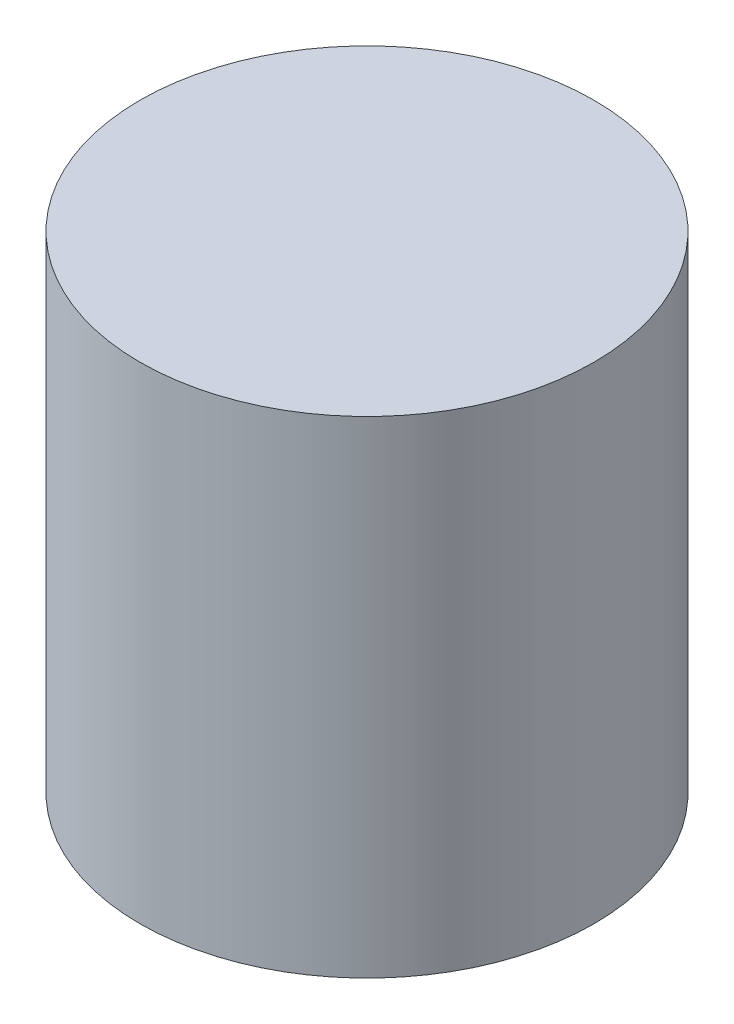
ISO-10303-21;
HEADER;
FILE_DESCRIPTION(('STEP AP214'),'2;1');
FILE_NAME('part.step','',(''),(''),'','','');
FILE_SCHEMA(('AUTOMOTIVE_DESIGN { 1 0 10303 214 1 1 1 1 }'));
ENDSEC;
DATA;
#1=APPLICATION_CONTEXT('core data for automotive mechanical design processes');
#2=APPLICATION_PROTOCOL_DEFINITION('international standard','automotive_design',2000,#1);
#3=PRODUCT_CONTEXT('',#1,'mechanical');
#4=PRODUCT('Part','Part','',(#3));
#5=PRODUCT_RELATED_PRODUCT_CATEGORY('part','',(#4));
#6=PRODUCT_DEFINITION_FORMATION('','',#4);
#7=PRODUCT_DEFINITION_CONTEXT('part definition',#1,'design');
#8=PRODUCT_DEFINITION('design','',#6,#7);
#9=PRODUCT_DEFINITION_SHAPE('','',#8);
#10=(LENGTH_UNIT() NAMED_UNIT(*) SI_UNIT(.MILLI.,.METRE.));
#11=(NAMED_UNIT(*) PLANE_ANGLE_UNIT() SI_UNIT($,.RADIAN.));
#12=(NAMED_UNIT(*) SI_UNIT($,.STERADIAN.) SOLID_ANGLE_UNIT());
#13=UNCERTAINTY_MEASURE_WITH_UNIT(LENGTH_MEASURE(1.E-05),#10,'distance_accuracy_value','');
#14=(GEOMETRIC_REPRESENTATION_CONTEXT(3) GLOBAL_UNCERTAINTY_ASSIGNED_CONTEXT((#13)) GLOBAL_UNIT_ASSIGNED_CONTEXT((#10,
#11,#12)) REPRESENTATION_CONTEXT('',''));
#15=CARTESIAN_POINT('',(0.,0.,0.));
#16=DIRECTION('',(0.,0.,1.));
#17=DIRECTION('',(1.,0.,0.));
#18=AXIS2_PLACEMENT_3D('',#15,#16,#17);
#19=CARTESIAN_POINT('',(0.,30.,0.));
#20=DIRECTION('',(0.,-1.,0.));
#21=DIRECTION('',(0.,0.,-1.));
#22=AXIS2_PLACEMENT_3D('',#19,#20,#21);
#23=CYLINDRICAL_SURFACE('',#22,14.);
#24=CARTESIAN_POINT('',(0.,30.,0.));
#25=DIRECTION('',(0.,1.,0.));
#26=DIRECTION('',(0.,0.,1.));
#27=AXIS2_PLACEMENT_3D('',#24,#25,#26);
#28=CIRCLE('',#27,14.);
#29=CARTESIAN_POINT('',(0.,30.,14.));
#30=VERTEX_POINT('',#29);
#31=EDGE_CURVE('E10',#30,#30,#28,.T.);
#32=ORIENTED_EDGE('',*,*,#31,.F.);
#33=EDGE_LOOP('',(#32));
#34=FACE_BOUND('',#33,.T.);
#35=CARTESIAN_POINT('',(0.,0.,0.));
#36=DIRECTION('',(0.,1.,0.));
#37=DIRECTION('',(0.,0.,1.));
#38=AXIS2_PLACEMENT_3D('',#35,#36,#37);
#39=CIRCLE('',#38,14.);
#40=CARTESIAN_POINT('',(0.,0.,14.));
#41=VERTEX_POINT('',#40);
#42=EDGE_CURVE('E34',#41,#41,#39,.T.);
#43=ORIENTED_EDGE('',*,*,#42,.T.);
#44=EDGE_LOOP('',(#43));
#45=FACE_BOUND('',#44,.T.);
#46=ADVANCED_FACE('F31',(#34,#45),#23,.T.);
#47=CARTESIAN_POINT('',(0.,30.,0.));
#48=DIRECTION('',(0.,1.,0.));
#49=DIRECTION('',(0.,0.,1.));
#50=AXIS2_PLACEMENT_3D('',#47,#48,#49);
#51=PLANE('',#50);
#52=ORIENTED_EDGE('',*,*,#31,.T.);
#53=EDGE_LOOP('',(#52));
#54=FACE_BOUND('',#53,.T.);
#55=ADVANCED_FACE('F46',(#54),#51,.T.);
#56=CARTESIAN_POINT('',(0.,0.,0.));
#57=DIRECTION('',(0.,1.,0.));
#58=DIRECTION('',(0.,0.,1.));
#59=AXIS2_PLACEMENT_3D('',#56,#57,#58);
#60=PLANE('',#59);
#61=ORIENTED_EDGE('',*,*,#42,.F.);
#62=EDGE_LOOP('',(#61));
#63=FACE_BOUND('',#62,.T.);
#64=ADVANCED_FACE('F44',(#63),#60,.F.);
#65=CLOSED_SHELL('',(#46,#55,#64));
#66=MANIFOLD_SOLID_BREP('B2',#65);
#67=ADVANCED_BREP_SHAPE_REPRESENTATION('',(#18,#66),#14);
#68=SHAPE_DEFINITION_REPRESENTATION(#9,#67);
ENDSEC;
END-ISO-10303-21;
